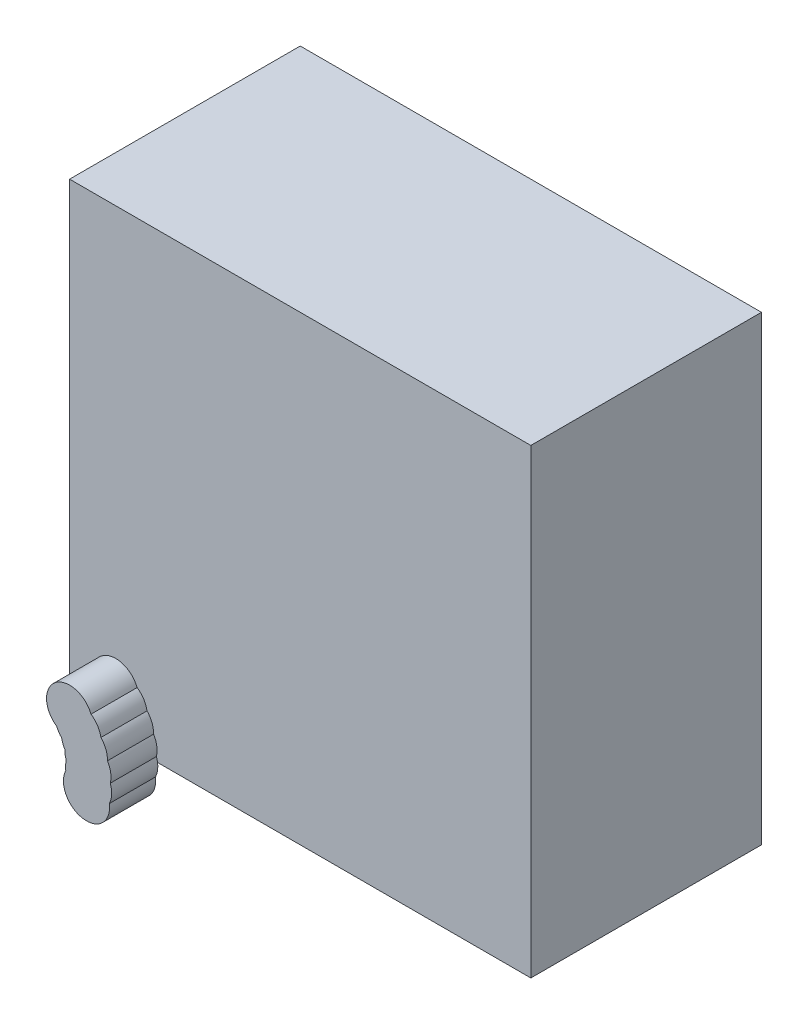
ISO-10303-21;
HEADER;
FILE_DESCRIPTION(('STEP AP214'),'2;1');
FILE_NAME('part.step','',(''),(''),'','','');
FILE_SCHEMA(('AUTOMOTIVE_DESIGN { 1 0 10303 214 1 1 1 1 }'));
ENDSEC;
DATA;
#1=APPLICATION_CONTEXT('core data for automotive mechanical design processes');
#2=APPLICATION_PROTOCOL_DEFINITION('international standard','automotive_design',2000,#1);
#3=PRODUCT_CONTEXT('',#1,'mechanical');
#4=PRODUCT('Part','Part','',(#3));
#5=PRODUCT_RELATED_PRODUCT_CATEGORY('part','',(#4));
#6=PRODUCT_DEFINITION_FORMATION('','',#4);
#7=PRODUCT_DEFINITION_CONTEXT('part definition',#1,'design');
#8=PRODUCT_DEFINITION('design','',#6,#7);
#9=PRODUCT_DEFINITION_SHAPE('','',#8);
#10=(LENGTH_UNIT() NAMED_UNIT(*) SI_UNIT(.MILLI.,.METRE.));
#11=(NAMED_UNIT(*) PLANE_ANGLE_UNIT() SI_UNIT($,.RADIAN.));
#12=(NAMED_UNIT(*) SI_UNIT($,.STERADIAN.) SOLID_ANGLE_UNIT());
#13=UNCERTAINTY_MEASURE_WITH_UNIT(LENGTH_MEASURE(1.E-05),#10,'distance_accuracy_value','');
#14=(GEOMETRIC_REPRESENTATION_CONTEXT(3) GLOBAL_UNCERTAINTY_ASSIGNED_CONTEXT((#13)) GLOBAL_UNIT_ASSIGNED_CONTEXT((#10,
#11,#12)) REPRESENTATION_CONTEXT('',''));
#15=CARTESIAN_POINT('',(0.,0.,0.));
#16=DIRECTION('',(0.,0.,1.));
#17=DIRECTION('',(1.,0.,0.));
#18=AXIS2_PLACEMENT_3D('',#15,#16,#17);
#19=CARTESIAN_POINT('',(2.,2.,12.));
#20=DIRECTION('',(0.,0.,-1.));
#21=DIRECTION('',(-1.,0.,0.));
#22=AXIS2_PLACEMENT_3D('',#19,#20,#21);
#23=CYLINDRICAL_SURFACE('',#22,1.);
#24=DIRECTION('',(0.,0.,-1.));
#25=VECTOR('',#24,1.);
#26=CARTESIAN_POINT('',(1.44365488132977,1.16904867234488,11.));
#27=LINE('',#26,#25);
#28=CARTESIAN_POINT('',(1.44365488132977,1.16904867234488,12.));
#29=VERTEX_POINT('',#28);
#30=CARTESIAN_POINT('',(1.44365488132977,1.16904867234488,10.));
#31=VERTEX_POINT('',#30);
#32=EDGE_CURVE('E223',#29,#31,#27,.T.);
#33=ORIENTED_EDGE('',*,*,#32,.F.);
#34=CARTESIAN_POINT('',(2.,2.,12.));
#35=DIRECTION('',(0.,0.,1.));
#36=DIRECTION('',(1.,0.,0.));
#37=AXIS2_PLACEMENT_3D('',#34,#35,#36);
#38=CIRCLE('',#37,1.);
#39=CARTESIAN_POINT('',(2.92846370177336,2.37142314748721,12.));
#40=VERTEX_POINT('',#39);
#41=EDGE_CURVE('E228',#40,#29,#38,.T.);
#42=ORIENTED_EDGE('',*,*,#41,.F.);
#43=DIRECTION('',(0.,0.,-1.));
#44=VECTOR('',#43,1.);
#45=CARTESIAN_POINT('',(2.92846370177336,2.37142314748721,11.));
#46=LINE('',#45,#44);
#47=CARTESIAN_POINT('',(2.92846370177336,2.37142314748721,10.));
#48=VERTEX_POINT('',#47);
#49=EDGE_CURVE('E217',#48,#40,#46,.F.);
#50=ORIENTED_EDGE('',*,*,#49,.F.);
#51=CARTESIAN_POINT('',(2.,2.,10.));
#52=DIRECTION('',(0.,0.,1.));
#53=DIRECTION('',(1.,0.,0.));
#54=AXIS2_PLACEMENT_3D('',#51,#52,#53);
#55=CIRCLE('',#54,1.);
#56=EDGE_CURVE('E11',#48,#31,#55,.T.);
#57=ORIENTED_EDGE('',*,*,#56,.T.);
#58=EDGE_LOOP('',(#33,#42,#50,#57));
#59=FACE_BOUND('',#58,.T.);
#60=ADVANCED_FACE('F45',(#59),#23,.T.);
#61=CARTESIAN_POINT('',(0.,0.,10.));
#62=DIRECTION('',(1.,0.,0.));
#63=DIRECTION('',(0.,0.,-1.));
#64=AXIS2_PLACEMENT_3D('',#61,#62,#63);
#65=PLANE('',#64);
#66=DIRECTION('',(0.,-1.,0.));
#67=VECTOR('',#66,1.);
#68=CARTESIAN_POINT('',(0.,0.,0.));
#69=LINE('',#68,#67);
#70=CARTESIAN_POINT('',(0.,20.,0.));
#71=VERTEX_POINT('',#70);
#72=CARTESIAN_POINT('',(0.,0.,0.));
#73=VERTEX_POINT('',#72);
#74=EDGE_CURVE('E230',#71,#73,#69,.T.);
#75=ORIENTED_EDGE('',*,*,#74,.T.);
#76=DIRECTION('',(0.,0.,-1.));
#77=VECTOR('',#76,1.);
#78=CARTESIAN_POINT('',(0.,0.,10.));
#79=LINE('',#78,#77);
#80=CARTESIAN_POINT('',(0.,0.,10.));
#81=VERTEX_POINT('',#80);
#82=EDGE_CURVE('E46',#81,#73,#79,.T.);
#83=ORIENTED_EDGE('',*,*,#82,.F.);
#84=DIRECTION('',(0.,-1.,0.));
#85=VECTOR('',#84,1.);
#86=CARTESIAN_POINT('',(0.,0.,10.));
#87=LINE('',#86,#85);
#88=CARTESIAN_POINT('',(0.,20.,10.));
#89=VERTEX_POINT('',#88);
#90=EDGE_CURVE('E235',#89,#81,#87,.T.);
#91=ORIENTED_EDGE('',*,*,#90,.F.);
#92=DIRECTION('',(0.,0.,-1.));
#93=VECTOR('',#92,1.);
#94=CARTESIAN_POINT('',(0.,20.,10.));
#95=LINE('',#94,#93);
#96=EDGE_CURVE('E245',#89,#71,#95,.T.);
#97=ORIENTED_EDGE('',*,*,#96,.T.);
#98=EDGE_LOOP('',(#75,#83,#91,#97));
#99=FACE_BOUND('',#98,.T.);
#100=ADVANCED_FACE('F42',(#99),#65,.F.);
#101=CARTESIAN_POINT('',(0.,0.,10.));
#102=DIRECTION('',(0.,1.,0.));
#103=DIRECTION('',(0.,0.,1.));
#104=AXIS2_PLACEMENT_3D('',#101,#102,#103);
#105=PLANE('',#104);
#106=DIRECTION('',(1.,0.,0.));
#107=VECTOR('',#106,1.);
#108=CARTESIAN_POINT('',(0.,0.,0.));
#109=LINE('',#108,#107);
#110=CARTESIAN_POINT('',(20.,0.,0.));
#111=VERTEX_POINT('',#110);
#112=EDGE_CURVE('E250',#73,#111,#109,.T.);
#113=ORIENTED_EDGE('',*,*,#112,.T.);
#114=DIRECTION('',(0.,0.,-1.));
#115=VECTOR('',#114,1.);
#116=CARTESIAN_POINT('',(20.,0.,10.));
#117=LINE('',#116,#115);
#118=CARTESIAN_POINT('',(20.,0.,10.));
#119=VERTEX_POINT('',#118);
#120=EDGE_CURVE('E258',#119,#111,#117,.T.);
#121=ORIENTED_EDGE('',*,*,#120,.F.);
#122=DIRECTION('',(1.,0.,0.));
#123=VECTOR('',#122,1.);
#124=CARTESIAN_POINT('',(0.,0.,10.));
#125=LINE('',#124,#123);
#126=CARTESIAN_POINT('',(3.81353396841853,0.,10.));
#127=VERTEX_POINT('',#126);
#128=EDGE_CURVE('E234',#127,#119,#125,.T.);
#129=ORIENTED_EDGE('',*,*,#128,.F.);
#130=CARTESIAN_POINT('',(1.83556775892648,0.,10.));
#131=VERTEX_POINT('',#130);
#132=EDGE_CURVE('E229',#131,#127,#125,.T.);
#133=ORIENTED_EDGE('',*,*,#132,.F.);
#134=EDGE_CURVE('E240',#81,#131,#125,.T.);
#135=ORIENTED_EDGE('',*,*,#134,.F.);
#136=ORIENTED_EDGE('',*,*,#82,.T.);
#137=EDGE_LOOP('',(#113,#121,#129,#133,#135,#136));
#138=FACE_BOUND('',#137,.T.);
#139=ADVANCED_FACE('F264',(#138),#105,.F.);
#140=CARTESIAN_POINT('',(20.,0.,10.));
#141=DIRECTION('',(-1.,0.,0.));
#142=DIRECTION('',(0.,0.,1.));
#143=AXIS2_PLACEMENT_3D('',#140,#141,#142);
#144=PLANE('',#143);
#145=DIRECTION('',(0.,1.,0.));
#146=VECTOR('',#145,1.);
#147=CARTESIAN_POINT('',(20.,0.,0.));
#148=LINE('',#147,#146);
#149=CARTESIAN_POINT('',(20.,20.,0.));
#150=VERTEX_POINT('',#149);
#151=EDGE_CURVE('E249',#111,#150,#148,.T.);
#152=ORIENTED_EDGE('',*,*,#151,.T.);
#153=DIRECTION('',(0.,0.,-1.));
#154=VECTOR('',#153,1.);
#155=CARTESIAN_POINT('',(20.,20.,10.));
#156=LINE('',#155,#154);
#157=CARTESIAN_POINT('',(20.,20.,10.));
#158=VERTEX_POINT('',#157);
#159=EDGE_CURVE('E255',#158,#150,#156,.T.);
#160=ORIENTED_EDGE('',*,*,#159,.F.);
#161=DIRECTION('',(0.,1.,0.));
#162=VECTOR('',#161,1.);
#163=CARTESIAN_POINT('',(20.,0.,10.));
#164=LINE('',#163,#162);
#165=EDGE_CURVE('E238',#119,#158,#164,.T.);
#166=ORIENTED_EDGE('',*,*,#165,.F.);
#167=ORIENTED_EDGE('',*,*,#120,.T.);
#168=EDGE_LOOP('',(#152,#160,#166,#167));
#169=FACE_BOUND('',#168,.T.);
#170=ADVANCED_FACE('F273',(#169),#144,.F.);
#171=CARTESIAN_POINT('',(0.,20.,10.));
#172=DIRECTION('',(0.,-1.,0.));
#173=DIRECTION('',(0.,0.,-1.));
#174=AXIS2_PLACEMENT_3D('',#171,#172,#173);
#175=PLANE('',#174);
#176=DIRECTION('',(-1.,0.,0.));
#177=VECTOR('',#176,1.);
#178=CARTESIAN_POINT('',(0.,20.,0.));
#179=LINE('',#178,#177);
#180=EDGE_CURVE('E237',#150,#71,#179,.T.);
#181=ORIENTED_EDGE('',*,*,#180,.T.);
#182=ORIENTED_EDGE('',*,*,#96,.F.);
#183=DIRECTION('',(-1.,0.,0.));
#184=VECTOR('',#183,1.);
#185=CARTESIAN_POINT('',(0.,20.,10.));
#186=LINE('',#185,#184);
#187=EDGE_CURVE('E244',#158,#89,#186,.T.);
#188=ORIENTED_EDGE('',*,*,#187,.F.);
#189=ORIENTED_EDGE('',*,*,#159,.T.);
#190=EDGE_LOOP('',(#181,#182,#188,#189));
#191=FACE_BOUND('',#190,.T.);
#192=ADVANCED_FACE('F280',(#191),#175,.F.);
#193=CARTESIAN_POINT('',(0.,0.,10.));
#194=DIRECTION('',(0.,0.,-1.));
#195=DIRECTION('',(-1.,0.,0.));
#196=AXIS2_PLACEMENT_3D('',#193,#194,#195);
#197=PLANE('',#196);
#198=CARTESIAN_POINT('',(2.82455086367251,-0.148028438237072,10.));
#199=DIRECTION('',(0.,0.,1.));
#200=DIRECTION('',(0.669130606358858,-0.743144825477394,0.));
#201=AXIS2_PLACEMENT_3D('',#198,#199,#200);
#202=CIRCLE('',#201,1.);
#203=CARTESIAN_POINT('',(1.85509090182455,0.0972211945327981,10.));
#204=VERTEX_POINT('',#203);
#205=EDGE_CURVE('E184',#204,#131,#202,.T.);
#206=ORIENTED_EDGE('',*,*,#205,.F.);
#207=CARTESIAN_POINT('',(2.79360449333484,0.442463484164949,10.));
#208=DIRECTION('',(0.,0.,1.));
#209=DIRECTION('',(0.809016994374947,-0.587785252292473,0.));
#210=AXIS2_PLACEMENT_3D('',#207,#208,#209);
#211=CIRCLE('',#210,1.);
#212=CARTESIAN_POINT('',(1.79433929182416,0.480791764191716,10.));
#213=VERTEX_POINT('',#212);
#214=EDGE_CURVE('E64',#213,#204,#211,.T.);
#215=ORIENTED_EDGE('',*,*,#214,.F.);
#216=CARTESIAN_POINT('',(2.6405642014368,1.0136176291336,10.));
#217=DIRECTION('',(0.,0.,1.));
#218=DIRECTION('',(0.913545457642601,-0.4067366430758,0.));
#219=AXIS2_PLACEMENT_3D('',#216,#217,#218);
#220=CIRCLE('',#219,1.);
#221=CARTESIAN_POINT('',(1.65516644457584,0.843349426660601,10.));
#222=VERTEX_POINT('',#221);
#223=EDGE_CURVE('E59',#222,#213,#220,.T.);
#224=ORIENTED_EDGE('',*,*,#223,.F.);
#225=CARTESIAN_POINT('',(2.37211858310313,1.54047181983209,10.));
#226=DIRECTION('',(0.,0.,1.));
#227=DIRECTION('',(0.978147600733806,-0.207911690817759,0.));
#228=AXIS2_PLACEMENT_3D('',#225,#226,#227);
#229=CIRCLE('',#228,1.);
#230=EDGE_CURVE('E212',#31,#222,#229,.T.);
#231=ORIENTED_EDGE('',*,*,#230,.F.);
#232=ORIENTED_EDGE('',*,*,#56,.F.);
#233=CARTESIAN_POINT('',(3.35751633996409,1.71074002230509,10.));
#234=VERTEX_POINT('',#233);
#235=EDGE_CURVE('E219',#234,#48,#229,.T.);
#236=ORIENTED_EDGE('',*,*,#235,.F.);
#237=CARTESIAN_POINT('',(3.63982940294749,0.975289349106834,10.));
#238=VERTEX_POINT('',#237);
#239=EDGE_CURVE('E206',#238,#234,#220,.T.);
#240=ORIENTED_EDGE('',*,*,#239,.F.);
#241=CARTESIAN_POINT('',(3.7630644551828,0.197213851395079,10.));
#242=VERTEX_POINT('',#241);
#243=EDGE_CURVE('E193',#242,#238,#211,.T.);
#244=ORIENTED_EDGE('',*,*,#243,.F.);
#245=EDGE_CURVE('E181',#127,#242,#202,.T.);
#246=ORIENTED_EDGE('',*,*,#245,.F.);
#247=ORIENTED_EDGE('',*,*,#128,.T.);
#248=ORIENTED_EDGE('',*,*,#165,.T.);
#249=ORIENTED_EDGE('',*,*,#187,.T.);
#250=ORIENTED_EDGE('',*,*,#90,.T.);
#251=ORIENTED_EDGE('',*,*,#134,.T.);
#252=EDGE_LOOP('',(#206,#215,#224,#231,#232,#236,#240,#244,#246,#247,#248,#249,#250,#251));
#253=FACE_BOUND('',#252,.T.);
#254=ADVANCED_FACE('F279',(#253),#197,.F.);
#255=CARTESIAN_POINT('',(0.,0.,0.));
#256=DIRECTION('',(0.,0.,-1.));
#257=DIRECTION('',(-1.,0.,0.));
#258=AXIS2_PLACEMENT_3D('',#255,#256,#257);
#259=PLANE('',#258);
#260=ORIENTED_EDGE('',*,*,#74,.F.);
#261=ORIENTED_EDGE('',*,*,#180,.F.);
#262=ORIENTED_EDGE('',*,*,#151,.F.);
#263=ORIENTED_EDGE('',*,*,#112,.F.);
#264=EDGE_LOOP('',(#260,#261,#262,#263));
#265=FACE_BOUND('',#264,.T.);
#266=ADVANCED_FACE('F275',(#265),#259,.T.);
#267=CARTESIAN_POINT('',(2.,2.,12.));
#268=DIRECTION('',(0.,0.,1.));
#269=DIRECTION('',(1.,0.,0.));
#270=AXIS2_PLACEMENT_3D('',#267,#268,#269);
#271=PLANE('',#270);
#272=ORIENTED_EDGE('',*,*,#41,.T.);
#273=CARTESIAN_POINT('',(2.37211858310313,1.54047181983209,12.));
#274=DIRECTION('',(0.,0.,1.));
#275=DIRECTION('',(0.978147600733806,-0.207911690817759,0.));
#276=AXIS2_PLACEMENT_3D('',#273,#274,#275);
#277=CIRCLE('',#276,1.);
#278=CARTESIAN_POINT('',(1.65516644457584,0.843349426660601,12.));
#279=VERTEX_POINT('',#278);
#280=EDGE_CURVE('E218',#29,#279,#277,.T.);
#281=ORIENTED_EDGE('',*,*,#280,.T.);
#282=CARTESIAN_POINT('',(2.6405642014368,1.0136176291336,12.));
#283=DIRECTION('',(0.,0.,1.));
#284=DIRECTION('',(0.913545457642601,-0.4067366430758,0.));
#285=AXIS2_PLACEMENT_3D('',#282,#283,#284);
#286=CIRCLE('',#285,1.);
#287=CARTESIAN_POINT('',(1.79433929182416,0.480791764191716,12.));
#288=VERTEX_POINT('',#287);
#289=EDGE_CURVE('E202',#279,#288,#286,.T.);
#290=ORIENTED_EDGE('',*,*,#289,.T.);
#291=CARTESIAN_POINT('',(2.79360449333484,0.442463484164949,12.));
#292=DIRECTION('',(0.,0.,1.));
#293=DIRECTION('',(0.809016994374947,-0.587785252292473,0.));
#294=AXIS2_PLACEMENT_3D('',#291,#292,#293);
#295=CIRCLE('',#294,1.);
#296=CARTESIAN_POINT('',(1.85509090182455,0.0972211945327981,12.));
#297=VERTEX_POINT('',#296);
#298=EDGE_CURVE('E195',#288,#297,#295,.T.);
#299=ORIENTED_EDGE('',*,*,#298,.T.);
#300=CARTESIAN_POINT('',(2.82455086367251,-0.148028438237072,12.));
#301=DIRECTION('',(0.,0.,1.));
#302=DIRECTION('',(0.669130606358858,-0.743144825477394,0.));
#303=AXIS2_PLACEMENT_3D('',#300,#301,#302);
#304=CIRCLE('',#303,1.);
#305=CARTESIAN_POINT('',(1.83476613770143,-0.290598407846251,12.));
#306=VERTEX_POINT('',#305);
#307=EDGE_CURVE('E159',#297,#306,#304,.T.);
#308=ORIENTED_EDGE('',*,*,#307,.T.);
#309=CARTESIAN_POINT('',(2.73205080756888,-0.732050807568877,12.));
#310=DIRECTION('',(0.,0.,1.));
#311=DIRECTION('',(0.5,-0.866025403784439,0.));
#312=AXIS2_PLACEMENT_3D('',#309,#310,#311);
#313=CIRCLE('',#312,1.);
#314=CARTESIAN_POINT('',(3.72183553353995,-0.589480837959698,12.));
#315=VERTEX_POINT('',#314);
#316=EDGE_CURVE('E170',#306,#315,#313,.T.);
#317=ORIENTED_EDGE('',*,*,#316,.T.);
#318=CARTESIAN_POINT('',(3.7630644551828,0.197213851395079,12.));
#319=VERTEX_POINT('',#318);
#320=EDGE_CURVE('E146',#315,#319,#304,.T.);
#321=ORIENTED_EDGE('',*,*,#320,.T.);
#322=CARTESIAN_POINT('',(3.63982940294749,0.975289349106834,12.));
#323=VERTEX_POINT('',#322);
#324=EDGE_CURVE('E190',#319,#323,#295,.T.);
#325=ORIENTED_EDGE('',*,*,#324,.T.);
#326=CARTESIAN_POINT('',(3.35751633996409,1.71074002230509,12.));
#327=VERTEX_POINT('',#326);
#328=EDGE_CURVE('E203',#323,#327,#286,.T.);
#329=ORIENTED_EDGE('',*,*,#328,.T.);
#330=EDGE_CURVE('E214',#327,#40,#277,.T.);
#331=ORIENTED_EDGE('',*,*,#330,.T.);
#332=EDGE_LOOP('',(#272,#281,#290,#299,#308,#317,#321,#325,#329,#331));
#333=FACE_BOUND('',#332,.T.);
#334=ADVANCED_FACE('F174',(#333),#271,.T.);
#335=CARTESIAN_POINT('',(2.37211858310313,1.54047181983209,12.));
#336=DIRECTION('',(0.,0.,-1.));
#337=DIRECTION('',(-1.,0.,0.));
#338=AXIS2_PLACEMENT_3D('',#335,#336,#337);
#339=CYLINDRICAL_SURFACE('',#338,1.);
#340=ORIENTED_EDGE('',*,*,#280,.F.);
#341=ORIENTED_EDGE('',*,*,#32,.T.);
#342=ORIENTED_EDGE('',*,*,#230,.T.);
#343=DIRECTION('',(0.,0.,-1.));
#344=VECTOR('',#343,1.);
#345=CARTESIAN_POINT('',(1.65516644457584,0.843349426660601,11.));
#346=LINE('',#345,#344);
#347=EDGE_CURVE('E211',#279,#222,#346,.T.);
#348=ORIENTED_EDGE('',*,*,#347,.F.);
#349=EDGE_LOOP('',(#340,#341,#342,#348));
#350=FACE_BOUND('',#349,.T.);
#351=ADVANCED_FACE('F297',(#350),#339,.T.);
#352=ORIENTED_EDGE('',*,*,#235,.T.);
#353=ORIENTED_EDGE('',*,*,#49,.T.);
#354=ORIENTED_EDGE('',*,*,#330,.F.);
#355=DIRECTION('',(0.,0.,-1.));
#356=VECTOR('',#355,1.);
#357=CARTESIAN_POINT('',(3.35751633996409,1.71074002230509,11.));
#358=LINE('',#357,#356);
#359=EDGE_CURVE('E204',#234,#327,#358,.F.);
#360=ORIENTED_EDGE('',*,*,#359,.F.);
#361=EDGE_LOOP('',(#352,#353,#354,#360));
#362=FACE_BOUND('',#361,.T.);
#363=ADVANCED_FACE('F295',(#362),#339,.T.);
#364=CARTESIAN_POINT('',(2.37211858310313,1.54047181983209,10.));
#365=DIRECTION('',(0.,0.,1.));
#366=DIRECTION('',(0.978147600733806,-0.207911690817759,0.));
#367=AXIS2_PLACEMENT_3D('',#364,#365,#366);
#368=PLANE('',#367);
#369=CARTESIAN_POINT('',(1.83476613770143,-0.290598407846251,10.));
#370=VERTEX_POINT('',#369);
#371=EDGE_CURVE('E177',#131,#370,#202,.T.);
#372=ORIENTED_EDGE('',*,*,#371,.F.);
#373=ORIENTED_EDGE('',*,*,#132,.T.);
#374=CARTESIAN_POINT('',(3.72183553353995,-0.589480837959698,10.));
#375=VERTEX_POINT('',#374);
#376=EDGE_CURVE('E182',#375,#127,#202,.T.);
#377=ORIENTED_EDGE('',*,*,#376,.F.);
#378=CARTESIAN_POINT('',(2.73205080756888,-0.732050807568877,10.));
#379=DIRECTION('',(0.,0.,1.));
#380=DIRECTION('',(0.5,-0.866025403784439,0.));
#381=AXIS2_PLACEMENT_3D('',#378,#379,#380);
#382=CIRCLE('',#381,1.);
#383=EDGE_CURVE('E166',#370,#375,#382,.T.);
#384=ORIENTED_EDGE('',*,*,#383,.F.);
#385=EDGE_LOOP('',(#372,#373,#377,#384));
#386=FACE_BOUND('',#385,.T.);
#387=ADVANCED_FACE('F284',(#386),#368,.F.);
#388=CARTESIAN_POINT('',(2.6405642014368,1.0136176291336,12.));
#389=DIRECTION('',(0.,0.,-1.));
#390=DIRECTION('',(-1.,0.,0.));
#391=AXIS2_PLACEMENT_3D('',#388,#389,#390);
#392=CYLINDRICAL_SURFACE('',#391,1.);
#393=ORIENTED_EDGE('',*,*,#289,.F.);
#394=ORIENTED_EDGE('',*,*,#347,.T.);
#395=ORIENTED_EDGE('',*,*,#223,.T.);
#396=DIRECTION('',(0.,0.,-1.));
#397=VECTOR('',#396,1.);
#398=CARTESIAN_POINT('',(1.79433929182416,0.480791764191716,11.));
#399=LINE('',#398,#397);
#400=EDGE_CURVE('E196',#288,#213,#399,.T.);
#401=ORIENTED_EDGE('',*,*,#400,.F.);
#402=EDGE_LOOP('',(#393,#394,#395,#401));
#403=FACE_BOUND('',#402,.T.);
#404=ADVANCED_FACE('F302',(#403),#392,.T.);
#405=ORIENTED_EDGE('',*,*,#239,.T.);
#406=ORIENTED_EDGE('',*,*,#359,.T.);
#407=ORIENTED_EDGE('',*,*,#328,.F.);
#408=DIRECTION('',(0.,0.,-1.));
#409=VECTOR('',#408,1.);
#410=CARTESIAN_POINT('',(3.63982940294749,0.975289349106834,11.));
#411=LINE('',#410,#409);
#412=EDGE_CURVE('E192',#238,#323,#411,.F.);
#413=ORIENTED_EDGE('',*,*,#412,.F.);
#414=EDGE_LOOP('',(#405,#406,#407,#413));
#415=FACE_BOUND('',#414,.T.);
#416=ADVANCED_FACE('F287',(#415),#392,.T.);
#417=CARTESIAN_POINT('',(2.79360449333484,0.442463484164949,12.));
#418=DIRECTION('',(0.,0.,-1.));
#419=DIRECTION('',(-1.,0.,0.));
#420=AXIS2_PLACEMENT_3D('',#417,#418,#419);
#421=CYLINDRICAL_SURFACE('',#420,1.);
#422=ORIENTED_EDGE('',*,*,#298,.F.);
#423=ORIENTED_EDGE('',*,*,#400,.T.);
#424=ORIENTED_EDGE('',*,*,#214,.T.);
#425=DIRECTION('',(0.,0.,-1.));
#426=VECTOR('',#425,1.);
#427=CARTESIAN_POINT('',(1.85509090182455,0.0972211945327982,11.));
#428=LINE('',#427,#426);
#429=EDGE_CURVE('E188',#297,#204,#428,.T.);
#430=ORIENTED_EDGE('',*,*,#429,.F.);
#431=EDGE_LOOP('',(#422,#423,#424,#430));
#432=FACE_BOUND('',#431,.T.);
#433=ADVANCED_FACE('F308',(#432),#421,.T.);
#434=ORIENTED_EDGE('',*,*,#243,.T.);
#435=ORIENTED_EDGE('',*,*,#412,.T.);
#436=ORIENTED_EDGE('',*,*,#324,.F.);
#437=DIRECTION('',(0.,0.,-1.));
#438=VECTOR('',#437,1.);
#439=CARTESIAN_POINT('',(3.7630644551828,0.197213851395079,11.));
#440=LINE('',#439,#438);
#441=EDGE_CURVE('E156',#242,#319,#440,.F.);
#442=ORIENTED_EDGE('',*,*,#441,.F.);
#443=EDGE_LOOP('',(#434,#435,#436,#442));
#444=FACE_BOUND('',#443,.T.);
#445=ADVANCED_FACE('F286',(#444),#421,.T.);
#446=CARTESIAN_POINT('',(2.82455086367251,-0.148028438237072,12.));
#447=DIRECTION('',(0.,0.,-1.));
#448=DIRECTION('',(-1.,0.,0.));
#449=AXIS2_PLACEMENT_3D('',#446,#447,#448);
#450=CYLINDRICAL_SURFACE('',#449,1.);
#451=ORIENTED_EDGE('',*,*,#307,.F.);
#452=ORIENTED_EDGE('',*,*,#429,.T.);
#453=ORIENTED_EDGE('',*,*,#205,.T.);
#454=ORIENTED_EDGE('',*,*,#371,.T.);
#455=DIRECTION('',(0.,0.,-1.));
#456=VECTOR('',#455,1.);
#457=CARTESIAN_POINT('',(1.83476613770143,-0.290598407846251,11.));
#458=LINE('',#457,#456);
#459=EDGE_CURVE('E168',#306,#370,#458,.T.);
#460=ORIENTED_EDGE('',*,*,#459,.F.);
#461=EDGE_LOOP('',(#451,#452,#453,#454,#460));
#462=FACE_BOUND('',#461,.T.);
#463=ADVANCED_FACE('F306',(#462),#450,.T.);
#464=ORIENTED_EDGE('',*,*,#376,.T.);
#465=ORIENTED_EDGE('',*,*,#245,.T.);
#466=ORIENTED_EDGE('',*,*,#441,.T.);
#467=ORIENTED_EDGE('',*,*,#320,.F.);
#468=DIRECTION('',(0.,0.,-1.));
#469=VECTOR('',#468,1.);
#470=CARTESIAN_POINT('',(3.72183553353995,-0.589480837959698,11.));
#471=LINE('',#470,#469);
#472=EDGE_CURVE('E155',#375,#315,#471,.F.);
#473=ORIENTED_EDGE('',*,*,#472,.F.);
#474=EDGE_LOOP('',(#464,#465,#466,#467,#473));
#475=FACE_BOUND('',#474,.T.);
#476=ADVANCED_FACE('F151',(#475),#450,.T.);
#477=CARTESIAN_POINT('',(2.73205080756888,-0.732050807568877,12.));
#478=DIRECTION('',(0.,0.,-1.));
#479=DIRECTION('',(-1.,0.,0.));
#480=AXIS2_PLACEMENT_3D('',#477,#478,#479);
#481=CYLINDRICAL_SURFACE('',#480,1.);
#482=ORIENTED_EDGE('',*,*,#316,.F.);
#483=ORIENTED_EDGE('',*,*,#459,.T.);
#484=ORIENTED_EDGE('',*,*,#383,.T.);
#485=ORIENTED_EDGE('',*,*,#472,.T.);
#486=EDGE_LOOP('',(#482,#483,#484,#485));
#487=FACE_BOUND('',#486,.T.);
#488=ADVANCED_FACE('F164',(#487),#481,.T.);
#489=CLOSED_SHELL('',(#60,#100,#139,#170,#192,#254,#266,#334,#351,#363,#387,#404,#416,#433,#445,
#463,#476,#488));
#490=MANIFOLD_SOLID_BREP('B2',#489);
#491=ADVANCED_BREP_SHAPE_REPRESENTATION('',(#18,#490),#14);
#492=SHAPE_DEFINITION_REPRESENTATION(#9,#491);
ENDSEC;
END-ISO-10303-21;
